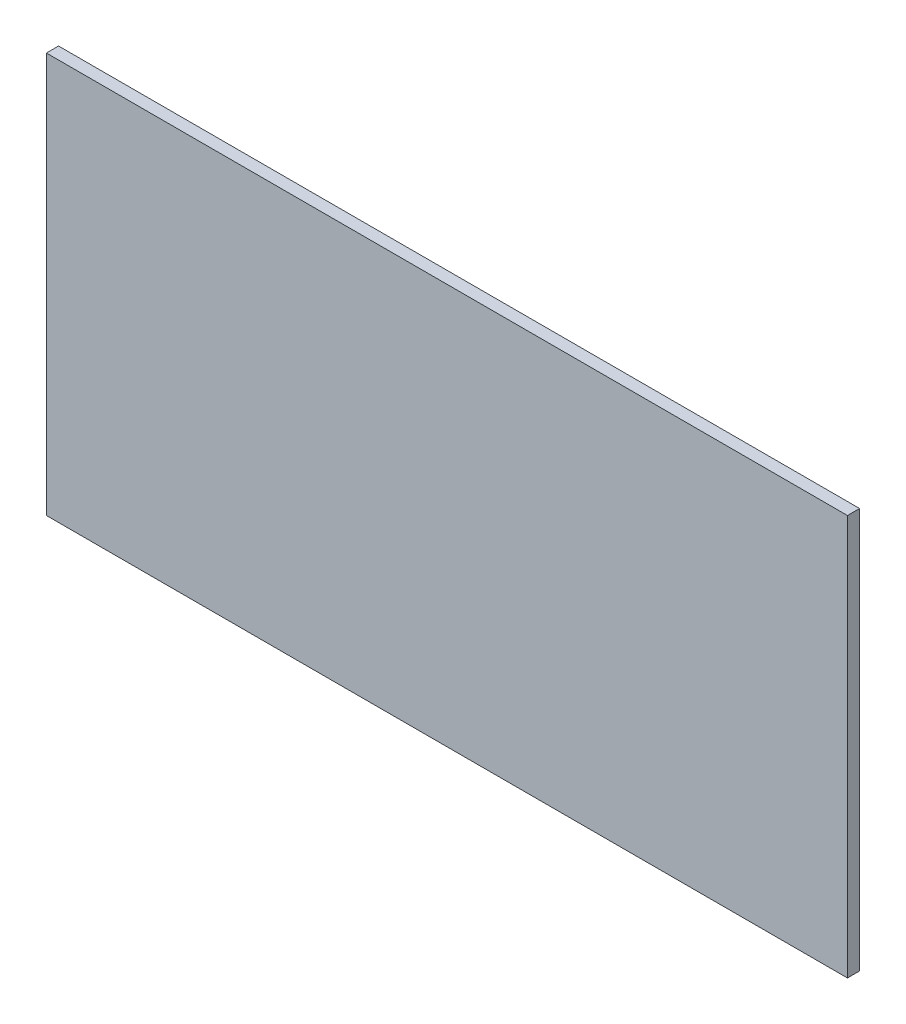
ISO-10303-21;
HEADER;
FILE_DESCRIPTION(('STEP AP214'),'2;1');
FILE_NAME('part.step','',(''),(''),'','','');
FILE_SCHEMA(('AUTOMOTIVE_DESIGN { 1 0 10303 214 1 1 1 1 }'));
ENDSEC;
DATA;
#1=APPLICATION_CONTEXT('core data for automotive mechanical design processes');
#2=APPLICATION_PROTOCOL_DEFINITION('international standard','automotive_design',2000,#1);
#3=PRODUCT_CONTEXT('',#1,'mechanical');
#4=PRODUCT('Part','Part','',(#3));
#5=PRODUCT_RELATED_PRODUCT_CATEGORY('part','',(#4));
#6=PRODUCT_DEFINITION_FORMATION('','',#4);
#7=PRODUCT_DEFINITION_CONTEXT('part definition',#1,'design');
#8=PRODUCT_DEFINITION('design','',#6,#7);
#9=PRODUCT_DEFINITION_SHAPE('','',#8);
#10=(LENGTH_UNIT() NAMED_UNIT(*) SI_UNIT(.MILLI.,.METRE.));
#11=(NAMED_UNIT(*) PLANE_ANGLE_UNIT() SI_UNIT($,.RADIAN.));
#12=(NAMED_UNIT(*) SI_UNIT($,.STERADIAN.) SOLID_ANGLE_UNIT());
#13=UNCERTAINTY_MEASURE_WITH_UNIT(LENGTH_MEASURE(1.E-05),#10,'distance_accuracy_value','');
#14=(GEOMETRIC_REPRESENTATION_CONTEXT(3) GLOBAL_UNCERTAINTY_ASSIGNED_CONTEXT((#13)) GLOBAL_UNIT_ASSIGNED_CONTEXT((#10,
#11,#12)) REPRESENTATION_CONTEXT('',''));
#15=CARTESIAN_POINT('',(0.,0.,0.));
#16=DIRECTION('',(0.,0.,1.));
#17=DIRECTION('',(1.,0.,0.));
#18=AXIS2_PLACEMENT_3D('',#15,#16,#17);
#19=CARTESIAN_POINT('',(-35.312101910828,38.0770288564103,2.));
#20=DIRECTION('',(1.,0.,0.));
#21=DIRECTION('',(0.,0.,-1.));
#22=AXIS2_PLACEMENT_3D('',#19,#20,#21);
#23=PLANE('',#22);
#24=DIRECTION('',(0.,-1.,0.));
#25=VECTOR('',#24,1.);
#26=CARTESIAN_POINT('',(-35.312101910828,38.0770288564103,0.));
#27=LINE('',#26,#25);
#28=CARTESIAN_POINT('',(-35.312101910828,38.0770288564103,0.));
#29=VERTEX_POINT('',#28);
#30=CARTESIAN_POINT('',(-35.312101910828,-27.9229711435897,0.));
#31=VERTEX_POINT('',#30);
#32=EDGE_CURVE('E111',#29,#31,#27,.T.);
#33=ORIENTED_EDGE('',*,*,#32,.T.);
#34=DIRECTION('',(0.,0.,-1.));
#35=VECTOR('',#34,1.);
#36=CARTESIAN_POINT('',(-35.312101910828,-27.9229711435897,2.));
#37=LINE('',#36,#35);
#38=CARTESIAN_POINT('',(-35.312101910828,-27.9229711435897,2.));
#39=VERTEX_POINT('',#38);
#40=EDGE_CURVE('E11',#39,#31,#37,.T.);
#41=ORIENTED_EDGE('',*,*,#40,.F.);
#42=DIRECTION('',(0.,-1.,0.));
#43=VECTOR('',#42,1.);
#44=CARTESIAN_POINT('',(-35.312101910828,38.0770288564103,2.));
#45=LINE('',#44,#43);
#46=CARTESIAN_POINT('',(-35.312101910828,38.0770288564103,2.));
#47=VERTEX_POINT('',#46);
#48=EDGE_CURVE('E95',#47,#39,#45,.T.);
#49=ORIENTED_EDGE('',*,*,#48,.F.);
#50=DIRECTION('',(0.,0.,-1.));
#51=VECTOR('',#50,1.);
#52=CARTESIAN_POINT('',(-35.312101910828,38.0770288564103,2.));
#53=LINE('',#52,#51);
#54=EDGE_CURVE('E107',#47,#29,#53,.T.);
#55=ORIENTED_EDGE('',*,*,#54,.T.);
#56=EDGE_LOOP('',(#33,#41,#49,#55));
#57=FACE_BOUND('',#56,.T.);
#58=ADVANCED_FACE('F43',(#57),#23,.F.);
#59=CARTESIAN_POINT('',(-35.312101910828,-27.9229711435897,2.));
#60=DIRECTION('',(0.,1.,0.));
#61=DIRECTION('',(-1.,0.,0.));
#62=AXIS2_PLACEMENT_3D('',#59,#60,#61);
#63=PLANE('',#62);
#64=DIRECTION('',(1.,0.,0.));
#65=VECTOR('',#64,1.);
#66=CARTESIAN_POINT('',(-35.312101910828,-27.9229711435897,0.));
#67=LINE('',#66,#65);
#68=CARTESIAN_POINT('',(96.687898089172,-27.9229711435897,0.));
#69=VERTEX_POINT('',#68);
#70=EDGE_CURVE('E100',#31,#69,#67,.T.);
#71=ORIENTED_EDGE('',*,*,#70,.T.);
#72=DIRECTION('',(0.,0.,-1.));
#73=VECTOR('',#72,1.);
#74=CARTESIAN_POINT('',(96.687898089172,-27.9229711435897,2.));
#75=LINE('',#74,#73);
#76=CARTESIAN_POINT('',(96.687898089172,-27.9229711435897,2.));
#77=VERTEX_POINT('',#76);
#78=EDGE_CURVE('E52',#77,#69,#75,.T.);
#79=ORIENTED_EDGE('',*,*,#78,.F.);
#80=DIRECTION('',(1.,0.,0.));
#81=VECTOR('',#80,1.);
#82=CARTESIAN_POINT('',(-35.312101910828,-27.9229711435897,2.));
#83=LINE('',#82,#81);
#84=EDGE_CURVE('E90',#39,#77,#83,.T.);
#85=ORIENTED_EDGE('',*,*,#84,.F.);
#86=ORIENTED_EDGE('',*,*,#40,.T.);
#87=EDGE_LOOP('',(#71,#79,#85,#86));
#88=FACE_BOUND('',#87,.T.);
#89=ADVANCED_FACE('F99',(#88),#63,.F.);
#90=CARTESIAN_POINT('',(96.687898089172,38.0770288564103,2.));
#91=DIRECTION('',(-1.,0.,0.));
#92=DIRECTION('',(0.,0.,1.));
#93=AXIS2_PLACEMENT_3D('',#90,#91,#92);
#94=PLANE('',#93);
#95=DIRECTION('',(0.,1.,0.));
#96=VECTOR('',#95,1.);
#97=CARTESIAN_POINT('',(96.687898089172,38.0770288564103,0.));
#98=LINE('',#97,#96);
#99=CARTESIAN_POINT('',(96.687898089172,38.0770288564103,0.));
#100=VERTEX_POINT('',#99);
#101=EDGE_CURVE('E77',#69,#100,#98,.T.);
#102=ORIENTED_EDGE('',*,*,#101,.T.);
#103=DIRECTION('',(0.,0.,-1.));
#104=VECTOR('',#103,1.);
#105=CARTESIAN_POINT('',(96.687898089172,38.0770288564103,2.));
#106=LINE('',#105,#104);
#107=CARTESIAN_POINT('',(96.687898089172,38.0770288564103,2.));
#108=VERTEX_POINT('',#107);
#109=EDGE_CURVE('E102',#108,#100,#106,.T.);
#110=ORIENTED_EDGE('',*,*,#109,.F.);
#111=DIRECTION('',(0.,1.,0.));
#112=VECTOR('',#111,1.);
#113=CARTESIAN_POINT('',(96.687898089172,38.0770288564103,2.));
#114=LINE('',#113,#112);
#115=EDGE_CURVE('E93',#77,#108,#114,.T.);
#116=ORIENTED_EDGE('',*,*,#115,.F.);
#117=ORIENTED_EDGE('',*,*,#78,.T.);
#118=EDGE_LOOP('',(#102,#110,#116,#117));
#119=FACE_BOUND('',#118,.T.);
#120=ADVANCED_FACE('F103',(#119),#94,.F.);
#121=CARTESIAN_POINT('',(-35.312101910828,38.0770288564103,2.));
#122=DIRECTION('',(0.,-1.,0.));
#123=DIRECTION('',(0.,0.,-1.));
#124=AXIS2_PLACEMENT_3D('',#121,#122,#123);
#125=PLANE('',#124);
#126=DIRECTION('',(-1.,0.,0.));
#127=VECTOR('',#126,1.);
#128=CARTESIAN_POINT('',(-35.312101910828,38.0770288564103,0.));
#129=LINE('',#128,#127);
#130=EDGE_CURVE('E83',#100,#29,#129,.T.);
#131=ORIENTED_EDGE('',*,*,#130,.T.);
#132=ORIENTED_EDGE('',*,*,#54,.F.);
#133=DIRECTION('',(-1.,0.,0.));
#134=VECTOR('',#133,1.);
#135=CARTESIAN_POINT('',(-35.312101910828,38.0770288564103,2.));
#136=LINE('',#135,#134);
#137=EDGE_CURVE('E60',#108,#47,#136,.T.);
#138=ORIENTED_EDGE('',*,*,#137,.F.);
#139=ORIENTED_EDGE('',*,*,#109,.T.);
#140=EDGE_LOOP('',(#131,#132,#138,#139));
#141=FACE_BOUND('',#140,.T.);
#142=ADVANCED_FACE('F124',(#141),#125,.F.);
#143=CARTESIAN_POINT('',(0.,0.,2.));
#144=DIRECTION('',(0.,0.,1.));
#145=DIRECTION('',(1.,0.,0.));
#146=AXIS2_PLACEMENT_3D('',#143,#144,#145);
#147=PLANE('',#146);
#148=ORIENTED_EDGE('',*,*,#48,.T.);
#149=ORIENTED_EDGE('',*,*,#84,.T.);
#150=ORIENTED_EDGE('',*,*,#115,.T.);
#151=ORIENTED_EDGE('',*,*,#137,.T.);
#152=EDGE_LOOP('',(#148,#149,#150,#151));
#153=FACE_BOUND('',#152,.T.);
#154=ADVANCED_FACE('F91',(#153),#147,.T.);
#155=CARTESIAN_POINT('',(0.,0.,0.));
#156=DIRECTION('',(0.,0.,1.));
#157=DIRECTION('',(1.,0.,0.));
#158=AXIS2_PLACEMENT_3D('',#155,#156,#157);
#159=PLANE('',#158);
#160=ORIENTED_EDGE('',*,*,#32,.F.);
#161=ORIENTED_EDGE('',*,*,#130,.F.);
#162=ORIENTED_EDGE('',*,*,#101,.F.);
#163=ORIENTED_EDGE('',*,*,#70,.F.);
#164=EDGE_LOOP('',(#160,#161,#162,#163));
#165=FACE_BOUND('',#164,.T.);
#166=ADVANCED_FACE('F127',(#165),#159,.F.);
#167=CLOSED_SHELL('',(#58,#89,#120,#142,#154,#166));
#168=MANIFOLD_SOLID_BREP('B2',#167);
#169=ADVANCED_BREP_SHAPE_REPRESENTATION('',(#18,#168),#14);
#170=SHAPE_DEFINITION_REPRESENTATION(#9,#169);
ENDSEC;
END-ISO-10303-21;
